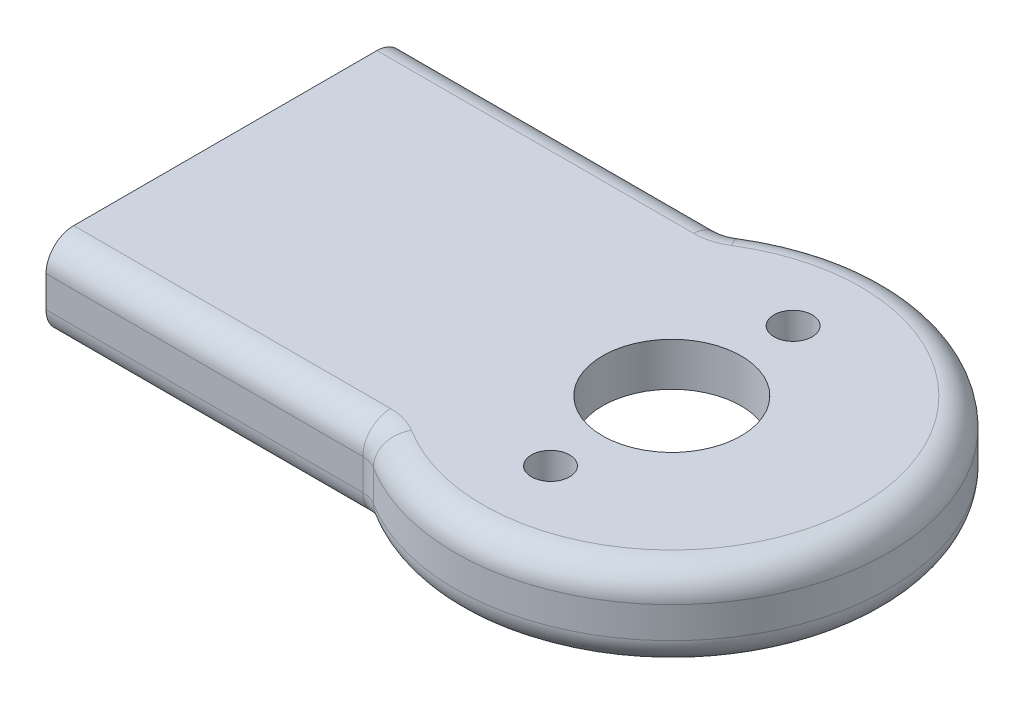
ISO-10303-21;
HEADER;
FILE_DESCRIPTION(('STEP AP214'),'2;1');
FILE_NAME('part.step','',(''),(''),'','','');
FILE_SCHEMA(('AUTOMOTIVE_DESIGN { 1 0 10303 214 1 1 1 1 }'));
ENDSEC;
DATA;
#1=APPLICATION_CONTEXT('core data for automotive mechanical design processes');
#2=APPLICATION_PROTOCOL_DEFINITION('international standard','automotive_design',2000,#1);
#3=PRODUCT_CONTEXT('',#1,'mechanical');
#4=PRODUCT('Part','Part','',(#3));
#5=PRODUCT_RELATED_PRODUCT_CATEGORY('part','',(#4));
#6=PRODUCT_DEFINITION_FORMATION('','',#4);
#7=PRODUCT_DEFINITION_CONTEXT('part definition',#1,'design');
#8=PRODUCT_DEFINITION('design','',#6,#7);
#9=PRODUCT_DEFINITION_SHAPE('','',#8);
#10=(LENGTH_UNIT() NAMED_UNIT(*) SI_UNIT(.MILLI.,.METRE.));
#11=(NAMED_UNIT(*) PLANE_ANGLE_UNIT() SI_UNIT($,.RADIAN.));
#12=(NAMED_UNIT(*) SI_UNIT($,.STERADIAN.) SOLID_ANGLE_UNIT());
#13=UNCERTAINTY_MEASURE_WITH_UNIT(LENGTH_MEASURE(1.E-05),#10,'distance_accuracy_value','');
#14=(GEOMETRIC_REPRESENTATION_CONTEXT(3) GLOBAL_UNCERTAINTY_ASSIGNED_CONTEXT((#13)) GLOBAL_UNIT_ASSIGNED_CONTEXT((#10,
#11,#12)) REPRESENTATION_CONTEXT('',''));
#15=CARTESIAN_POINT('',(0.,0.,0.));
#16=DIRECTION('',(0.,0.,1.));
#17=DIRECTION('',(1.,0.,0.));
#18=AXIS2_PLACEMENT_3D('',#15,#16,#17);
#19=CARTESIAN_POINT('',(0.,2.5,0.));
#20=DIRECTION('',(0.,1.,0.));
#21=DIRECTION('',(0.,0.,1.));
#22=AXIS2_PLACEMENT_3D('',#19,#20,#21);
#23=PLANE('',#22);
#24=DIRECTION('',(0.,0.,1.));
#25=VECTOR('',#24,1.);
#26=CARTESIAN_POINT('',(-25.7669633602051,2.5,-10.35));
#27=LINE('',#26,#25);
#28=CARTESIAN_POINT('',(-25.7669633602051,2.5,-8.75));
#29=VERTEX_POINT('',#28);
#30=CARTESIAN_POINT('',(-25.7669633602051,2.5,8.75));
#31=VERTEX_POINT('',#30);
#32=EDGE_CURVE('E201',#29,#31,#27,.T.);
#33=ORIENTED_EDGE('',*,*,#32,.T.);
#34=DIRECTION('',(1.,0.,0.));
#35=VECTOR('',#34,1.);
#36=CARTESIAN_POINT('',(-7.0091012262629,2.5,8.75));
#37=LINE('',#36,#35);
#38=CARTESIAN_POINT('',(-7.4838158715992,2.5,8.75));
#39=VERTEX_POINT('',#38);
#40=EDGE_CURVE('E222',#31,#39,#37,.T.);
#41=ORIENTED_EDGE('',*,*,#40,.T.);
#42=CARTESIAN_POINT('',(-7.4838158715992,2.5,11.95));
#43=DIRECTION('',(0.,1.,0.));
#44=DIRECTION('',(0.,0.,1.));
#45=AXIS2_PLACEMENT_3D('',#42,#43,#44);
#46=CIRCLE('',#45,3.2);
#47=CARTESIAN_POINT('',(-5.78536120570434,2.5,9.23794326241134));
#48=VERTEX_POINT('',#47);
#49=EDGE_CURVE('E219',#48,#39,#46,.T.);
#50=ORIENTED_EDGE('',*,*,#49,.F.);
#51=CARTESIAN_POINT('',(0.,2.5,0.));
#52=DIRECTION('',(0.,1.,0.));
#53=DIRECTION('',(0.,0.,1.));
#54=AXIS2_PLACEMENT_3D('',#51,#52,#53);
#55=CIRCLE('',#54,10.9);
#56=CARTESIAN_POINT('',(-5.78536120570434,2.5,-9.23794326241134));
#57=VERTEX_POINT('',#56);
#58=EDGE_CURVE('E215',#48,#57,#55,.T.);
#59=ORIENTED_EDGE('',*,*,#58,.T.);
#60=CARTESIAN_POINT('',(-7.4838158715992,2.5,-11.95));
#61=DIRECTION('',(0.,1.,0.));
#62=DIRECTION('',(0.,0.,1.));
#63=AXIS2_PLACEMENT_3D('',#60,#61,#62);
#64=CIRCLE('',#63,3.2);
#65=CARTESIAN_POINT('',(-7.4838158715992,2.5,-8.75));
#66=VERTEX_POINT('',#65);
#67=EDGE_CURVE('E212',#66,#57,#64,.T.);
#68=ORIENTED_EDGE('',*,*,#67,.F.);
#69=DIRECTION('',(-1.,0.,0.));
#70=VECTOR('',#69,1.);
#71=CARTESIAN_POINT('',(-25.7669633602051,2.5,-8.75));
#72=LINE('',#71,#70);
#73=EDGE_CURVE('E217',#66,#29,#72,.T.);
#74=ORIENTED_EDGE('',*,*,#73,.T.);
#75=EDGE_LOOP('',(#33,#41,#50,#59,#68,#74));
#76=FACE_BOUND('',#75,.T.);
#77=CARTESIAN_POINT('',(0.,2.5,-7.));
#78=DIRECTION('',(0.,1.,0.));
#79=DIRECTION('',(0.,0.,1.));
#80=AXIS2_PLACEMENT_3D('',#77,#78,#79);
#81=CIRCLE('',#80,1.1);
#82=CARTESIAN_POINT('',(0.,2.5,-5.9));
#83=VERTEX_POINT('',#82);
#84=EDGE_CURVE('E194',#83,#83,#81,.T.);
#85=ORIENTED_EDGE('',*,*,#84,.F.);
#86=EDGE_LOOP('',(#85));
#87=FACE_BOUND('',#86,.T.);
#88=CARTESIAN_POINT('',(0.,2.5,0.));
#89=DIRECTION('',(0.,1.,0.));
#90=DIRECTION('',(0.,0.,1.));
#91=AXIS2_PLACEMENT_3D('',#88,#89,#90);
#92=CIRCLE('',#91,4.);
#93=CARTESIAN_POINT('',(0.,2.5,4.));
#94=VERTEX_POINT('',#93);
#95=EDGE_CURVE('E197',#94,#94,#92,.T.);
#96=ORIENTED_EDGE('',*,*,#95,.F.);
#97=EDGE_LOOP('',(#96));
#98=FACE_BOUND('',#97,.T.);
#99=CARTESIAN_POINT('',(0.,2.5,7.));
#100=DIRECTION('',(0.,1.,0.));
#101=DIRECTION('',(0.,0.,-1.));
#102=AXIS2_PLACEMENT_3D('',#99,#100,#101);
#103=CIRCLE('',#102,1.1);
#104=CARTESIAN_POINT('',(0.,2.5,5.9));
#105=VERTEX_POINT('',#104);
#106=EDGE_CURVE('E188',#105,#105,#103,.T.);
#107=ORIENTED_EDGE('',*,*,#106,.F.);
#108=EDGE_LOOP('',(#107));
#109=FACE_BOUND('',#108,.T.);
#110=ADVANCED_FACE('F33',(#76,#87,#98,#109),#23,.T.);
#111=CARTESIAN_POINT('',(0.,-2.5,0.));
#112=DIRECTION('',(0.,1.,0.));
#113=DIRECTION('',(0.,0.,1.));
#114=AXIS2_PLACEMENT_3D('',#111,#112,#113);
#115=PLANE('',#114);
#116=CARTESIAN_POINT('',(0.,-2.5,0.));
#117=DIRECTION('',(0.,1.,0.));
#118=DIRECTION('',(0.,0.,1.));
#119=AXIS2_PLACEMENT_3D('',#116,#117,#118);
#120=CIRCLE('',#119,10.7);
#121=CARTESIAN_POINT('',(0.,-2.5,10.7));
#122=VERTEX_POINT('',#121);
#123=EDGE_CURVE('E176',#122,#122,#120,.F.);
#124=ORIENTED_EDGE('',*,*,#123,.F.);
#125=EDGE_LOOP('',(#124));
#126=FACE_BOUND('',#125,.T.);
#127=CARTESIAN_POINT('',(-7.4838158715992,-2.5,11.95));
#128=DIRECTION('',(0.,1.,0.));
#129=DIRECTION('',(0.,0.,1.));
#130=AXIS2_PLACEMENT_3D('',#127,#128,#129);
#131=CIRCLE('',#130,3.2);
#132=CARTESIAN_POINT('',(-7.4838158715992,-2.5,8.75));
#133=VERTEX_POINT('',#132);
#134=CARTESIAN_POINT('',(-5.78536120570434,-2.5,9.23794326241134));
#135=VERTEX_POINT('',#134);
#136=EDGE_CURVE('E239',#133,#135,#131,.F.);
#137=ORIENTED_EDGE('',*,*,#136,.F.);
#138=DIRECTION('',(1.,0.,0.));
#139=VECTOR('',#138,1.);
#140=CARTESIAN_POINT('',(0.,-2.5,8.75));
#141=LINE('',#140,#139);
#142=CARTESIAN_POINT('',(-25.7669633602051,-2.5,8.75));
#143=VERTEX_POINT('',#142);
#144=EDGE_CURVE('E249',#133,#143,#141,.F.);
#145=ORIENTED_EDGE('',*,*,#144,.T.);
#146=DIRECTION('',(0.,0.,1.));
#147=VECTOR('',#146,1.);
#148=CARTESIAN_POINT('',(-25.7669633602051,-2.5,-10.35));
#149=LINE('',#148,#147);
#150=CARTESIAN_POINT('',(-25.7669633602051,-2.5,-8.75));
#151=VERTEX_POINT('',#150);
#152=EDGE_CURVE('E200',#151,#143,#149,.T.);
#153=ORIENTED_EDGE('',*,*,#152,.F.);
#154=DIRECTION('',(-1.,0.,0.));
#155=VECTOR('',#154,1.);
#156=CARTESIAN_POINT('',(0.,-2.5,-8.75));
#157=LINE('',#156,#155);
#158=CARTESIAN_POINT('',(-7.4838158715992,-2.5,-8.75));
#159=VERTEX_POINT('',#158);
#160=EDGE_CURVE('E247',#151,#159,#157,.F.);
#161=ORIENTED_EDGE('',*,*,#160,.T.);
#162=CARTESIAN_POINT('',(-7.4838158715992,-2.5,-11.95));
#163=DIRECTION('',(0.,1.,0.));
#164=DIRECTION('',(0.,0.,1.));
#165=AXIS2_PLACEMENT_3D('',#162,#163,#164);
#166=CIRCLE('',#165,3.2);
#167=CARTESIAN_POINT('',(-5.78536120570434,-2.5,-9.23794326241134));
#168=VERTEX_POINT('',#167);
#169=EDGE_CURVE('E244',#168,#159,#166,.F.);
#170=ORIENTED_EDGE('',*,*,#169,.F.);
#171=CARTESIAN_POINT('',(0.,-2.5,0.));
#172=DIRECTION('',(0.,1.,0.));
#173=DIRECTION('',(0.,0.,1.));
#174=AXIS2_PLACEMENT_3D('',#171,#172,#173);
#175=CIRCLE('',#174,10.9);
#176=EDGE_CURVE('E242',#168,#135,#175,.F.);
#177=ORIENTED_EDGE('',*,*,#176,.T.);
#178=EDGE_LOOP('',(#137,#145,#153,#161,#170,#177));
#179=FACE_BOUND('',#178,.T.);
#180=ADVANCED_FACE('F318',(#126,#179),#115,.F.);
#181=CARTESIAN_POINT('',(-25.7669633602051,2.5,-10.35));
#182=DIRECTION('',(1.,0.,0.));
#183=DIRECTION('',(0.,0.,-1.));
#184=AXIS2_PLACEMENT_3D('',#181,#182,#183);
#185=PLANE('',#184);
#186=DIRECTION('',(0.,0.,1.));
#187=VECTOR('',#186,1.);
#188=CARTESIAN_POINT('',(-25.7669633602051,-1.,-6.55));
#189=LINE('',#188,#187);
#190=CARTESIAN_POINT('',(-25.7669633602051,-1.,-6.55));
#191=VERTEX_POINT('',#190);
#192=CARTESIAN_POINT('',(-25.7669633602051,-1.,6.55));
#193=VERTEX_POINT('',#192);
#194=EDGE_CURVE('E182',#191,#193,#189,.T.);
#195=ORIENTED_EDGE('',*,*,#194,.F.);
#196=DIRECTION('',(0.,-1.,0.));
#197=VECTOR('',#196,1.);
#198=CARTESIAN_POINT('',(-25.7669633602051,1.,-6.55));
#199=LINE('',#198,#197);
#200=CARTESIAN_POINT('',(-25.7669633602051,1.,-6.55));
#201=VERTEX_POINT('',#200);
#202=EDGE_CURVE('E153',#201,#191,#199,.T.);
#203=ORIENTED_EDGE('',*,*,#202,.F.);
#204=DIRECTION('',(0.,0.,-1.));
#205=VECTOR('',#204,1.);
#206=CARTESIAN_POINT('',(-25.7669633602051,1.,-6.55));
#207=LINE('',#206,#205);
#208=CARTESIAN_POINT('',(-25.7669633602051,1.,6.55));
#209=VERTEX_POINT('',#208);
#210=EDGE_CURVE('E170',#209,#201,#207,.T.);
#211=ORIENTED_EDGE('',*,*,#210,.F.);
#212=DIRECTION('',(0.,1.,0.));
#213=VECTOR('',#212,1.);
#214=CARTESIAN_POINT('',(-25.7669633602051,1.,6.55));
#215=LINE('',#214,#213);
#216=EDGE_CURVE('E173',#193,#209,#215,.T.);
#217=ORIENTED_EDGE('',*,*,#216,.F.);
#218=EDGE_LOOP('',(#195,#203,#211,#217));
#219=FACE_BOUND('',#218,.T.);
#220=DIRECTION('',(0.,-1.,0.));
#221=VECTOR('',#220,1.);
#222=CARTESIAN_POINT('',(-25.7669633602051,2.5,10.35));
#223=LINE('',#222,#221);
#224=CARTESIAN_POINT('',(-25.7669633602051,0.9,10.35));
#225=VERTEX_POINT('',#224);
#226=CARTESIAN_POINT('',(-25.7669633602051,-0.9,10.35));
#227=VERTEX_POINT('',#226);
#228=EDGE_CURVE('E209',#225,#227,#223,.T.);
#229=ORIENTED_EDGE('',*,*,#228,.F.);
#230=CARTESIAN_POINT('',(-25.7669633602051,0.9,8.75));
#231=DIRECTION('',(1.,0.,0.));
#232=DIRECTION('',(0.,0.,-1.));
#233=AXIS2_PLACEMENT_3D('',#230,#231,#232);
#234=CIRCLE('',#233,1.6);
#235=EDGE_CURVE('E237',#225,#31,#234,.F.);
#236=ORIENTED_EDGE('',*,*,#235,.T.);
#237=ORIENTED_EDGE('',*,*,#32,.F.);
#238=CARTESIAN_POINT('',(-25.7669633602051,0.9,-8.75));
#239=DIRECTION('',(1.,0.,0.));
#240=DIRECTION('',(0.,0.,-1.));
#241=AXIS2_PLACEMENT_3D('',#238,#239,#240);
#242=CIRCLE('',#241,1.6);
#243=CARTESIAN_POINT('',(-25.7669633602051,0.9,-10.35));
#244=VERTEX_POINT('',#243);
#245=EDGE_CURVE('E233',#29,#244,#242,.F.);
#246=ORIENTED_EDGE('',*,*,#245,.T.);
#247=DIRECTION('',(0.,-1.,0.));
#248=VECTOR('',#247,1.);
#249=CARTESIAN_POINT('',(-25.7669633602051,2.5,-10.35));
#250=LINE('',#249,#248);
#251=CARTESIAN_POINT('',(-25.7669633602051,-0.9,-10.35));
#252=VERTEX_POINT('',#251);
#253=EDGE_CURVE('E204',#244,#252,#250,.T.);
#254=ORIENTED_EDGE('',*,*,#253,.T.);
#255=CARTESIAN_POINT('',(-25.7669633602051,-0.9,-8.75));
#256=DIRECTION('',(1.,0.,0.));
#257=DIRECTION('',(0.,0.,-1.));
#258=AXIS2_PLACEMENT_3D('',#255,#256,#257);
#259=CIRCLE('',#258,1.6);
#260=EDGE_CURVE('E231',#252,#151,#259,.F.);
#261=ORIENTED_EDGE('',*,*,#260,.T.);
#262=ORIENTED_EDGE('',*,*,#152,.T.);
#263=CARTESIAN_POINT('',(-25.7669633602051,-0.9,8.75));
#264=DIRECTION('',(1.,0.,0.));
#265=DIRECTION('',(0.,0.,-1.));
#266=AXIS2_PLACEMENT_3D('',#263,#264,#265);
#267=CIRCLE('',#266,1.6);
#268=EDGE_CURVE('E235',#143,#227,#267,.F.);
#269=ORIENTED_EDGE('',*,*,#268,.T.);
#270=EDGE_LOOP('',(#229,#236,#237,#246,#254,#261,#262,#269));
#271=FACE_BOUND('',#270,.T.);
#272=ADVANCED_FACE('F321',(#219,#271),#185,.F.);
#273=CARTESIAN_POINT('',(-25.7669633602051,2.5,10.35));
#274=DIRECTION('',(0.,0.,-1.));
#275=DIRECTION('',(-1.,0.,0.));
#276=AXIS2_PLACEMENT_3D('',#273,#274,#275);
#277=PLANE('',#276);
#278=DIRECTION('',(0.,1.,0.));
#279=VECTOR('',#278,1.);
#280=CARTESIAN_POINT('',(-7.4838158715992,2.5,10.35));
#281=LINE('',#280,#279);
#282=CARTESIAN_POINT('',(-7.4838158715992,-0.9,10.35));
#283=VERTEX_POINT('',#282);
#284=CARTESIAN_POINT('',(-7.4838158715992,0.9,10.35));
#285=VERTEX_POINT('',#284);
#286=EDGE_CURVE('E225',#283,#285,#281,.T.);
#287=ORIENTED_EDGE('',*,*,#286,.T.);
#288=DIRECTION('',(1.,0.,0.));
#289=VECTOR('',#288,1.);
#290=CARTESIAN_POINT('',(-25.7669633602051,0.9,10.35));
#291=LINE('',#290,#289);
#292=EDGE_CURVE('E229',#285,#225,#291,.F.);
#293=ORIENTED_EDGE('',*,*,#292,.T.);
#294=ORIENTED_EDGE('',*,*,#228,.T.);
#295=DIRECTION('',(1.,0.,0.));
#296=VECTOR('',#295,1.);
#297=CARTESIAN_POINT('',(-25.7669633602051,-0.9,10.35));
#298=LINE('',#297,#296);
#299=EDGE_CURVE('E227',#227,#283,#298,.T.);
#300=ORIENTED_EDGE('',*,*,#299,.T.);
#301=EDGE_LOOP('',(#287,#293,#294,#300));
#302=FACE_BOUND('',#301,.T.);
#303=ADVANCED_FACE('F342',(#302),#277,.F.);
#304=CARTESIAN_POINT('',(0.,2.5,0.));
#305=DIRECTION('',(0.,-1.,0.));
#306=DIRECTION('',(0.,0.,-1.));
#307=AXIS2_PLACEMENT_3D('',#304,#305,#306);
#308=CYLINDRICAL_SURFACE('',#307,12.5);
#309=CARTESIAN_POINT('',(0.,0.9,0.));
#310=DIRECTION('',(0.,1.,0.));
#311=DIRECTION('',(0.,0.,1.));
#312=AXIS2_PLACEMENT_3D('',#309,#310,#311);
#313=CIRCLE('',#312,12.5);
#314=CARTESIAN_POINT('',(-6.63458853865177,0.9,-10.5939716312057));
#315=VERTEX_POINT('',#314);
#316=CARTESIAN_POINT('',(-6.63458853865177,0.9,10.5939716312057));
#317=VERTEX_POINT('',#316);
#318=EDGE_CURVE('E42',#315,#317,#313,.F.);
#319=ORIENTED_EDGE('',*,*,#318,.T.);
#320=DIRECTION('',(0.,-1.,0.));
#321=VECTOR('',#320,1.);
#322=CARTESIAN_POINT('',(-6.63458853865177,2.5,10.5939716312057));
#323=LINE('',#322,#321);
#324=CARTESIAN_POINT('',(-6.63458853865177,-0.9,10.5939716312057));
#325=VERTEX_POINT('',#324);
#326=EDGE_CURVE('E11',#317,#325,#323,.T.);
#327=ORIENTED_EDGE('',*,*,#326,.T.);
#328=CARTESIAN_POINT('',(0.,-0.9,0.));
#329=DIRECTION('',(0.,1.,0.));
#330=DIRECTION('',(0.,0.,1.));
#331=AXIS2_PLACEMENT_3D('',#328,#329,#330);
#332=CIRCLE('',#331,12.5);
#333=CARTESIAN_POINT('',(-6.63458853865177,-0.9,-10.5939716312057));
#334=VERTEX_POINT('',#333);
#335=EDGE_CURVE('E257',#325,#334,#332,.T.);
#336=ORIENTED_EDGE('',*,*,#335,.T.);
#337=DIRECTION('',(0.,-1.,0.));
#338=VECTOR('',#337,1.);
#339=CARTESIAN_POINT('',(-6.63458853865177,2.5,-10.5939716312057));
#340=LINE('',#339,#338);
#341=EDGE_CURVE('E53',#334,#315,#340,.F.);
#342=ORIENTED_EDGE('',*,*,#341,.T.);
#343=EDGE_LOOP('',(#319,#327,#336,#342));
#344=FACE_BOUND('',#343,.T.);
#345=ADVANCED_FACE('F391',(#344),#308,.T.);
#346=CARTESIAN_POINT('',(-25.7669633602051,2.5,-10.35));
#347=DIRECTION('',(0.,0.,1.));
#348=DIRECTION('',(1.,0.,0.));
#349=AXIS2_PLACEMENT_3D('',#346,#347,#348);
#350=PLANE('',#349);
#351=ORIENTED_EDGE('',*,*,#253,.F.);
#352=DIRECTION('',(-1.,0.,0.));
#353=VECTOR('',#352,1.);
#354=CARTESIAN_POINT('',(-7.0091012262629,0.9,-10.35));
#355=LINE('',#354,#353);
#356=CARTESIAN_POINT('',(-7.4838158715992,0.9,-10.35));
#357=VERTEX_POINT('',#356);
#358=EDGE_CURVE('E255',#244,#357,#355,.F.);
#359=ORIENTED_EDGE('',*,*,#358,.T.);
#360=DIRECTION('',(0.,1.,0.));
#361=VECTOR('',#360,1.);
#362=CARTESIAN_POINT('',(-7.4838158715992,-2.5,-10.35));
#363=LINE('',#362,#361);
#364=CARTESIAN_POINT('',(-7.4838158715992,-0.9,-10.35));
#365=VERTEX_POINT('',#364);
#366=EDGE_CURVE('E251',#357,#365,#363,.F.);
#367=ORIENTED_EDGE('',*,*,#366,.T.);
#368=DIRECTION('',(-1.,0.,0.));
#369=VECTOR('',#368,1.);
#370=CARTESIAN_POINT('',(-25.7669633602051,-0.9,-10.35));
#371=LINE('',#370,#369);
#372=EDGE_CURVE('E253',#365,#252,#371,.T.);
#373=ORIENTED_EDGE('',*,*,#372,.T.);
#374=EDGE_LOOP('',(#351,#359,#367,#373));
#375=FACE_BOUND('',#374,.T.);
#376=ADVANCED_FACE('F362',(#375),#350,.F.);
#377=CARTESIAN_POINT('',(0.,2.5,0.));
#378=DIRECTION('',(0.,-1.,0.));
#379=DIRECTION('',(0.,0.,-1.));
#380=AXIS2_PLACEMENT_3D('',#377,#378,#379);
#381=CYLINDRICAL_SURFACE('',#380,4.);
#382=CARTESIAN_POINT('',(0.,0.,0.));
#383=DIRECTION('',(0.,1.,0.));
#384=DIRECTION('',(0.,0.,1.));
#385=AXIS2_PLACEMENT_3D('',#382,#383,#384);
#386=CIRCLE('',#385,4.);
#387=CARTESIAN_POINT('',(0.,0.,4.));
#388=VERTEX_POINT('',#387);
#389=EDGE_CURVE('E303',#388,#388,#386,.F.);
#390=ORIENTED_EDGE('',*,*,#389,.T.);
#391=EDGE_LOOP('',(#390));
#392=FACE_BOUND('',#391,.T.);
#393=ORIENTED_EDGE('',*,*,#95,.T.);
#394=EDGE_LOOP('',(#393));
#395=FACE_BOUND('',#394,.T.);
#396=ADVANCED_FACE('F386',(#392,#395),#381,.F.);
#397=CARTESIAN_POINT('',(0.,2.5,-7.));
#398=DIRECTION('',(0.,-1.,0.));
#399=DIRECTION('',(0.,0.,-1.));
#400=AXIS2_PLACEMENT_3D('',#397,#398,#399);
#401=CYLINDRICAL_SURFACE('',#400,1.1);
#402=CARTESIAN_POINT('',(0.,0.,-7.));
#403=DIRECTION('',(0.,1.,0.));
#404=DIRECTION('',(0.,0.,1.));
#405=AXIS2_PLACEMENT_3D('',#402,#403,#404);
#406=CIRCLE('',#405,1.1);
#407=CARTESIAN_POINT('',(0.,0.,-5.9));
#408=VERTEX_POINT('',#407);
#409=EDGE_CURVE('E298',#408,#408,#406,.F.);
#410=ORIENTED_EDGE('',*,*,#409,.T.);
#411=EDGE_LOOP('',(#410));
#412=FACE_BOUND('',#411,.T.);
#413=ORIENTED_EDGE('',*,*,#84,.T.);
#414=EDGE_LOOP('',(#413));
#415=FACE_BOUND('',#414,.T.);
#416=ADVANCED_FACE('F421',(#412,#415),#401,.F.);
#417=CARTESIAN_POINT('',(0.,2.5,7.));
#418=DIRECTION('',(0.,-1.,0.));
#419=DIRECTION('',(0.,0.,-1.));
#420=AXIS2_PLACEMENT_3D('',#417,#418,#419);
#421=CYLINDRICAL_SURFACE('',#420,1.1);
#422=CARTESIAN_POINT('',(0.,0.,7.));
#423=DIRECTION('',(0.,1.,0.));
#424=DIRECTION('',(0.,0.,1.));
#425=AXIS2_PLACEMENT_3D('',#422,#423,#424);
#426=CIRCLE('',#425,1.1);
#427=CARTESIAN_POINT('',(0.,0.,8.1));
#428=VERTEX_POINT('',#427);
#429=EDGE_CURVE('E294',#428,#428,#426,.F.);
#430=ORIENTED_EDGE('',*,*,#429,.T.);
#431=EDGE_LOOP('',(#430));
#432=FACE_BOUND('',#431,.T.);
#433=ORIENTED_EDGE('',*,*,#106,.T.);
#434=EDGE_LOOP('',(#433));
#435=FACE_BOUND('',#434,.T.);
#436=ADVANCED_FACE('F413',(#432,#435),#421,.F.);
#437=CARTESIAN_POINT('',(-10.7669633602051,1.,-6.55));
#438=DIRECTION('',(0.,0.,-1.));
#439=DIRECTION('',(-1.,0.,0.));
#440=AXIS2_PLACEMENT_3D('',#437,#438,#439);
#441=PLANE('',#440);
#442=ORIENTED_EDGE('',*,*,#202,.T.);
#443=DIRECTION('',(-1.,0.,0.));
#444=VECTOR('',#443,1.);
#445=CARTESIAN_POINT('',(-10.7669633602051,-1.,-6.55));
#446=LINE('',#445,#444);
#447=CARTESIAN_POINT('',(-10.7669633602051,-1.,-6.55));
#448=VERTEX_POINT('',#447);
#449=EDGE_CURVE('E146',#448,#191,#446,.T.);
#450=ORIENTED_EDGE('',*,*,#449,.F.);
#451=DIRECTION('',(0.,-1.,0.));
#452=VECTOR('',#451,1.);
#453=CARTESIAN_POINT('',(-10.7669633602051,1.,-6.55));
#454=LINE('',#453,#452);
#455=CARTESIAN_POINT('',(-10.7669633602051,1.,-6.55));
#456=VERTEX_POINT('',#455);
#457=EDGE_CURVE('E150',#456,#448,#454,.T.);
#458=ORIENTED_EDGE('',*,*,#457,.F.);
#459=DIRECTION('',(-1.,0.,0.));
#460=VECTOR('',#459,1.);
#461=CARTESIAN_POINT('',(-10.7669633602051,1.,-6.55));
#462=LINE('',#461,#460);
#463=EDGE_CURVE('E186',#456,#201,#462,.T.);
#464=ORIENTED_EDGE('',*,*,#463,.T.);
#465=EDGE_LOOP('',(#442,#450,#458,#464));
#466=FACE_BOUND('',#465,.T.);
#467=ADVANCED_FACE('F148',(#466),#441,.F.);
#468=CARTESIAN_POINT('',(-10.7669633602051,1.,-6.55));
#469=DIRECTION('',(0.,1.,0.));
#470=DIRECTION('',(0.,0.,1.));
#471=AXIS2_PLACEMENT_3D('',#468,#469,#470);
#472=PLANE('',#471);
#473=ORIENTED_EDGE('',*,*,#210,.T.);
#474=ORIENTED_EDGE('',*,*,#463,.F.);
#475=DIRECTION('',(0.,0.,-1.));
#476=VECTOR('',#475,1.);
#477=CARTESIAN_POINT('',(-10.7669633602051,1.,-6.55));
#478=LINE('',#477,#476);
#479=CARTESIAN_POINT('',(-10.7669633602051,1.,6.55));
#480=VERTEX_POINT('',#479);
#481=EDGE_CURVE('E158',#480,#456,#478,.T.);
#482=ORIENTED_EDGE('',*,*,#481,.F.);
#483=DIRECTION('',(-1.,0.,0.));
#484=VECTOR('',#483,1.);
#485=CARTESIAN_POINT('',(-10.7669633602051,1.,6.55));
#486=LINE('',#485,#484);
#487=EDGE_CURVE('E189',#480,#209,#486,.T.);
#488=ORIENTED_EDGE('',*,*,#487,.T.);
#489=EDGE_LOOP('',(#473,#474,#482,#488));
#490=FACE_BOUND('',#489,.T.);
#491=ADVANCED_FACE('F405',(#490),#472,.F.);
#492=CARTESIAN_POINT('',(-10.7669633602051,1.,6.55));
#493=DIRECTION('',(0.,0.,1.));
#494=DIRECTION('',(0.,-1.,0.));
#495=AXIS2_PLACEMENT_3D('',#492,#493,#494);
#496=PLANE('',#495);
#497=ORIENTED_EDGE('',*,*,#216,.T.);
#498=ORIENTED_EDGE('',*,*,#487,.F.);
#499=DIRECTION('',(0.,1.,0.));
#500=VECTOR('',#499,1.);
#501=CARTESIAN_POINT('',(-10.7669633602051,1.,6.55));
#502=LINE('',#501,#500);
#503=CARTESIAN_POINT('',(-10.7669633602051,-1.,6.55));
#504=VERTEX_POINT('',#503);
#505=EDGE_CURVE('E166',#504,#480,#502,.T.);
#506=ORIENTED_EDGE('',*,*,#505,.F.);
#507=DIRECTION('',(-1.,0.,0.));
#508=VECTOR('',#507,1.);
#509=CARTESIAN_POINT('',(-10.7669633602051,-1.,6.55));
#510=LINE('',#509,#508);
#511=EDGE_CURVE('E157',#504,#193,#510,.T.);
#512=ORIENTED_EDGE('',*,*,#511,.T.);
#513=EDGE_LOOP('',(#497,#498,#506,#512));
#514=FACE_BOUND('',#513,.T.);
#515=ADVANCED_FACE('F403',(#514),#496,.F.);
#516=CARTESIAN_POINT('',(-10.7669633602051,-1.,-6.55));
#517=DIRECTION('',(0.,-1.,0.));
#518=DIRECTION('',(0.,0.,-1.));
#519=AXIS2_PLACEMENT_3D('',#516,#517,#518);
#520=PLANE('',#519);
#521=ORIENTED_EDGE('',*,*,#194,.T.);
#522=ORIENTED_EDGE('',*,*,#511,.F.);
#523=DIRECTION('',(0.,0.,1.));
#524=VECTOR('',#523,1.);
#525=CARTESIAN_POINT('',(-10.7669633602051,-1.,-6.55));
#526=LINE('',#525,#524);
#527=EDGE_CURVE('E161',#448,#504,#526,.T.);
#528=ORIENTED_EDGE('',*,*,#527,.F.);
#529=ORIENTED_EDGE('',*,*,#449,.T.);
#530=EDGE_LOOP('',(#521,#522,#528,#529));
#531=FACE_BOUND('',#530,.T.);
#532=ADVANCED_FACE('F162',(#531),#520,.F.);
#533=CARTESIAN_POINT('',(-10.7669633602051,0.,0.));
#534=DIRECTION('',(-1.,0.,0.));
#535=DIRECTION('',(0.,0.,1.));
#536=AXIS2_PLACEMENT_3D('',#533,#534,#535);
#537=PLANE('',#536);
#538=ORIENTED_EDGE('',*,*,#457,.T.);
#539=ORIENTED_EDGE('',*,*,#527,.T.);
#540=ORIENTED_EDGE('',*,*,#505,.T.);
#541=ORIENTED_EDGE('',*,*,#481,.T.);
#542=EDGE_LOOP('',(#538,#539,#540,#541));
#543=FACE_BOUND('',#542,.T.);
#544=ADVANCED_FACE('F168',(#543),#537,.T.);
#545=CARTESIAN_POINT('',(0.,-2.501,0.));
#546=DIRECTION('',(0.,1.,0.));
#547=DIRECTION('',(0.,0.,1.));
#548=AXIS2_PLACEMENT_3D('',#545,#546,#547);
#549=CYLINDRICAL_SURFACE('',#548,10.7);
#550=CARTESIAN_POINT('',(0.,0.,0.));
#551=DIRECTION('',(0.,1.,0.));
#552=DIRECTION('',(0.,0.,1.));
#553=AXIS2_PLACEMENT_3D('',#550,#551,#552);
#554=CIRCLE('',#553,10.7);
#555=CARTESIAN_POINT('',(0.,0.,10.7));
#556=VERTEX_POINT('',#555);
#557=EDGE_CURVE('E306',#556,#556,#554,.T.);
#558=ORIENTED_EDGE('',*,*,#557,.T.);
#559=EDGE_LOOP('',(#558));
#560=FACE_BOUND('',#559,.T.);
#561=ORIENTED_EDGE('',*,*,#123,.T.);
#562=EDGE_LOOP('',(#561));
#563=FACE_BOUND('',#562,.T.);
#564=ADVANCED_FACE('F316',(#560,#563),#549,.F.);
#565=CARTESIAN_POINT('',(0.,0.,0.));
#566=DIRECTION('',(0.,1.,0.));
#567=DIRECTION('',(0.,0.,1.));
#568=AXIS2_PLACEMENT_3D('',#565,#566,#567);
#569=PLANE('',#568);
#570=ORIENTED_EDGE('',*,*,#389,.F.);
#571=EDGE_LOOP('',(#570));
#572=FACE_BOUND('',#571,.T.);
#573=ORIENTED_EDGE('',*,*,#409,.F.);
#574=EDGE_LOOP('',(#573));
#575=FACE_BOUND('',#574,.T.);
#576=ORIENTED_EDGE('',*,*,#429,.F.);
#577=EDGE_LOOP('',(#576));
#578=FACE_BOUND('',#577,.T.);
#579=ORIENTED_EDGE('',*,*,#557,.F.);
#580=EDGE_LOOP('',(#579));
#581=FACE_BOUND('',#580,.T.);
#582=ADVANCED_FACE('F437',(#572,#575,#578,#581),#569,.F.);
#583=CARTESIAN_POINT('',(-25.7669633602051,-0.9,-8.75));
#584=DIRECTION('',(-1.,0.,0.));
#585=DIRECTION('',(0.,0.,1.));
#586=AXIS2_PLACEMENT_3D('',#583,#584,#585);
#587=CYLINDRICAL_SURFACE('',#586,1.6);
#588=CARTESIAN_POINT('',(-7.4838158715992,-0.9,-8.75));
#589=DIRECTION('',(1.,0.,0.));
#590=DIRECTION('',(0.,0.,-1.));
#591=AXIS2_PLACEMENT_3D('',#588,#589,#590);
#592=CIRCLE('',#591,1.6);
#593=EDGE_CURVE('E37',#159,#365,#592,.T.);
#594=ORIENTED_EDGE('',*,*,#593,.F.);
#595=ORIENTED_EDGE('',*,*,#160,.F.);
#596=ORIENTED_EDGE('',*,*,#260,.F.);
#597=ORIENTED_EDGE('',*,*,#372,.F.);
#598=EDGE_LOOP('',(#594,#595,#596,#597));
#599=FACE_BOUND('',#598,.T.);
#600=ADVANCED_FACE('F35',(#599),#587,.T.);
#601=CARTESIAN_POINT('',(-7.4838158715992,-0.9,-11.95));
#602=DIRECTION('',(0.,1.,0.));
#603=DIRECTION('',(0.,0.,1.));
#604=AXIS2_PLACEMENT_3D('',#601,#602,#603);
#605=TOROIDAL_SURFACE('',#604,3.2,1.6);
#606=ORIENTED_EDGE('',*,*,#169,.T.);
#607=ORIENTED_EDGE('',*,*,#593,.T.);
#608=CARTESIAN_POINT('',(-7.4838158715992,-0.9,-11.95));
#609=DIRECTION('',(0.,1.,0.));
#610=DIRECTION('',(0.,0.,1.));
#611=AXIS2_PLACEMENT_3D('',#608,#609,#610);
#612=CIRCLE('',#611,1.6);
#613=EDGE_CURVE('E288',#334,#365,#612,.F.);
#614=ORIENTED_EDGE('',*,*,#613,.F.);
#615=CARTESIAN_POINT('',(-5.78536120570434,-0.9,-9.23794326241134));
#616=DIRECTION('',(-0.847517730496454,0.,0.530767083092141));
#617=DIRECTION('',(0.530767083092141,0.,0.847517730496454));
#618=AXIS2_PLACEMENT_3D('',#615,#616,#617);
#619=CIRCLE('',#618,1.6);
#620=EDGE_CURVE('E286',#168,#334,#619,.F.);
#621=ORIENTED_EDGE('',*,*,#620,.F.);
#622=EDGE_LOOP('',(#606,#607,#614,#621));
#623=FACE_BOUND('',#622,.T.);
#624=ADVANCED_FACE('F447',(#623),#605,.T.);
#625=CARTESIAN_POINT('',(0.,0.9,-8.75));
#626=DIRECTION('',(1.,0.,0.));
#627=DIRECTION('',(0.,0.,-1.));
#628=AXIS2_PLACEMENT_3D('',#625,#626,#627);
#629=CYLINDRICAL_SURFACE('',#628,1.6);
#630=ORIENTED_EDGE('',*,*,#245,.F.);
#631=ORIENTED_EDGE('',*,*,#73,.F.);
#632=CARTESIAN_POINT('',(-7.4838158715992,0.9,-8.75));
#633=DIRECTION('',(1.,0.,0.));
#634=DIRECTION('',(0.,0.,-1.));
#635=AXIS2_PLACEMENT_3D('',#632,#633,#634);
#636=CIRCLE('',#635,1.6);
#637=EDGE_CURVE('E283',#357,#66,#636,.T.);
#638=ORIENTED_EDGE('',*,*,#637,.F.);
#639=ORIENTED_EDGE('',*,*,#358,.F.);
#640=EDGE_LOOP('',(#630,#631,#638,#639));
#641=FACE_BOUND('',#640,.T.);
#642=ADVANCED_FACE('F359',(#641),#629,.T.);
#643=CARTESIAN_POINT('',(-7.4838158715992,2.5,-11.95));
#644=DIRECTION('',(0.,-1.,0.));
#645=DIRECTION('',(0.,0.,-1.));
#646=AXIS2_PLACEMENT_3D('',#643,#644,#645);
#647=CYLINDRICAL_SURFACE('',#646,1.6);
#648=ORIENTED_EDGE('',*,*,#613,.T.);
#649=ORIENTED_EDGE('',*,*,#366,.F.);
#650=CARTESIAN_POINT('',(-7.4838158715992,0.9,-11.95));
#651=DIRECTION('',(0.,1.,0.));
#652=DIRECTION('',(0.,0.,1.));
#653=AXIS2_PLACEMENT_3D('',#650,#651,#652);
#654=CIRCLE('',#653,1.6);
#655=EDGE_CURVE('E280',#315,#357,#654,.F.);
#656=ORIENTED_EDGE('',*,*,#655,.F.);
#657=ORIENTED_EDGE('',*,*,#341,.F.);
#658=EDGE_LOOP('',(#648,#649,#656,#657));
#659=FACE_BOUND('',#658,.T.);
#660=ADVANCED_FACE('F364',(#659),#647,.F.);
#661=CARTESIAN_POINT('',(0.,-0.9,0.));
#662=DIRECTION('',(0.,1.,0.));
#663=DIRECTION('',(0.,0.,1.));
#664=AXIS2_PLACEMENT_3D('',#661,#662,#663);
#665=TOROIDAL_SURFACE('',#664,10.9,1.6);
#666=ORIENTED_EDGE('',*,*,#620,.T.);
#667=ORIENTED_EDGE('',*,*,#335,.F.);
#668=CARTESIAN_POINT('',(-5.78536120570434,-0.9,9.23794326241134));
#669=DIRECTION('',(-0.847517730496454,0.,-0.530767083092141));
#670=DIRECTION('',(-0.530767083092141,0.,0.847517730496454));
#671=AXIS2_PLACEMENT_3D('',#668,#669,#670);
#672=CIRCLE('',#671,1.6);
#673=EDGE_CURVE('E277',#135,#325,#672,.T.);
#674=ORIENTED_EDGE('',*,*,#673,.F.);
#675=ORIENTED_EDGE('',*,*,#176,.F.);
#676=EDGE_LOOP('',(#666,#667,#674,#675));
#677=FACE_BOUND('',#676,.T.);
#678=ADVANCED_FACE('F552',(#677),#665,.T.);
#679=CARTESIAN_POINT('',(-25.7669633602051,-0.9,8.75));
#680=DIRECTION('',(1.,0.,0.));
#681=DIRECTION('',(0.,0.,-1.));
#682=AXIS2_PLACEMENT_3D('',#679,#680,#681);
#683=CYLINDRICAL_SURFACE('',#682,1.6);
#684=ORIENTED_EDGE('',*,*,#268,.F.);
#685=ORIENTED_EDGE('',*,*,#144,.F.);
#686=CARTESIAN_POINT('',(-7.4838158715992,-0.9,8.75));
#687=DIRECTION('',(1.,0.,0.));
#688=DIRECTION('',(0.,0.,-1.));
#689=AXIS2_PLACEMENT_3D('',#686,#687,#688);
#690=CIRCLE('',#689,1.6);
#691=EDGE_CURVE('E274',#283,#133,#690,.T.);
#692=ORIENTED_EDGE('',*,*,#691,.F.);
#693=ORIENTED_EDGE('',*,*,#299,.F.);
#694=EDGE_LOOP('',(#684,#685,#692,#693));
#695=FACE_BOUND('',#694,.T.);
#696=ADVANCED_FACE('F331',(#695),#683,.T.);
#697=CARTESIAN_POINT('',(-7.4838158715992,0.9,-11.95));
#698=DIRECTION('',(0.,1.,0.));
#699=DIRECTION('',(0.,0.,1.));
#700=AXIS2_PLACEMENT_3D('',#697,#698,#699);
#701=TOROIDAL_SURFACE('',#700,3.2,1.6);
#702=ORIENTED_EDGE('',*,*,#637,.T.);
#703=ORIENTED_EDGE('',*,*,#67,.T.);
#704=CARTESIAN_POINT('',(-5.78536120570434,0.9,-9.23794326241134));
#705=DIRECTION('',(-0.847517730496454,0.,0.530767083092141));
#706=DIRECTION('',(0.530767083092141,0.,0.847517730496454));
#707=AXIS2_PLACEMENT_3D('',#704,#705,#706);
#708=CIRCLE('',#707,1.6);
#709=EDGE_CURVE('E271',#315,#57,#708,.F.);
#710=ORIENTED_EDGE('',*,*,#709,.F.);
#711=ORIENTED_EDGE('',*,*,#655,.T.);
#712=EDGE_LOOP('',(#702,#703,#710,#711));
#713=FACE_BOUND('',#712,.T.);
#714=ADVANCED_FACE('F367',(#713),#701,.T.);
#715=CARTESIAN_POINT('',(-7.4838158715992,-0.9,11.95));
#716=DIRECTION('',(0.,1.,0.));
#717=DIRECTION('',(0.,0.,1.));
#718=AXIS2_PLACEMENT_3D('',#715,#716,#717);
#719=TOROIDAL_SURFACE('',#718,3.2,1.6);
#720=ORIENTED_EDGE('',*,*,#136,.T.);
#721=ORIENTED_EDGE('',*,*,#673,.T.);
#722=CARTESIAN_POINT('',(-7.4838158715992,-0.9,11.95));
#723=DIRECTION('',(0.,1.,0.));
#724=DIRECTION('',(0.,0.,1.));
#725=AXIS2_PLACEMENT_3D('',#722,#723,#724);
#726=CIRCLE('',#725,1.6);
#727=EDGE_CURVE('E269',#283,#325,#726,.F.);
#728=ORIENTED_EDGE('',*,*,#727,.F.);
#729=ORIENTED_EDGE('',*,*,#691,.T.);
#730=EDGE_LOOP('',(#720,#721,#728,#729));
#731=FACE_BOUND('',#730,.T.);
#732=ADVANCED_FACE('F334',(#731),#719,.T.);
#733=CARTESIAN_POINT('',(0.,0.9,0.));
#734=DIRECTION('',(0.,1.,0.));
#735=DIRECTION('',(0.,0.,1.));
#736=AXIS2_PLACEMENT_3D('',#733,#734,#735);
#737=TOROIDAL_SURFACE('',#736,10.9,1.6);
#738=ORIENTED_EDGE('',*,*,#709,.T.);
#739=ORIENTED_EDGE('',*,*,#58,.F.);
#740=CARTESIAN_POINT('',(-5.78536120570434,0.9,9.23794326241134));
#741=DIRECTION('',(-0.847517730496454,0.,-0.530767083092141));
#742=DIRECTION('',(-0.530767083092141,0.,0.847517730496454));
#743=AXIS2_PLACEMENT_3D('',#740,#741,#742);
#744=CIRCLE('',#743,1.6);
#745=EDGE_CURVE('E266',#317,#48,#744,.T.);
#746=ORIENTED_EDGE('',*,*,#745,.F.);
#747=ORIENTED_EDGE('',*,*,#318,.F.);
#748=EDGE_LOOP('',(#738,#739,#746,#747));
#749=FACE_BOUND('',#748,.T.);
#750=ADVANCED_FACE('F370',(#749),#737,.T.);
#751=CARTESIAN_POINT('',(-7.4838158715992,2.5,11.95));
#752=DIRECTION('',(0.,-1.,0.));
#753=DIRECTION('',(0.,0.,-1.));
#754=AXIS2_PLACEMENT_3D('',#751,#752,#753);
#755=CYLINDRICAL_SURFACE('',#754,1.6);
#756=ORIENTED_EDGE('',*,*,#727,.T.);
#757=ORIENTED_EDGE('',*,*,#326,.F.);
#758=CARTESIAN_POINT('',(-7.4838158715992,0.9,11.95));
#759=DIRECTION('',(0.,1.,0.));
#760=DIRECTION('',(0.,0.,1.));
#761=AXIS2_PLACEMENT_3D('',#758,#759,#760);
#762=CIRCLE('',#761,1.6);
#763=EDGE_CURVE('E263',#285,#317,#762,.F.);
#764=ORIENTED_EDGE('',*,*,#763,.F.);
#765=ORIENTED_EDGE('',*,*,#286,.F.);
#766=EDGE_LOOP('',(#756,#757,#764,#765));
#767=FACE_BOUND('',#766,.T.);
#768=ADVANCED_FACE('F339',(#767),#755,.F.);
#769=CARTESIAN_POINT('',(-7.4838158715992,0.9,11.95));
#770=DIRECTION('',(0.,1.,0.));
#771=DIRECTION('',(0.,0.,1.));
#772=AXIS2_PLACEMENT_3D('',#769,#770,#771);
#773=TOROIDAL_SURFACE('',#772,3.2,1.6);
#774=ORIENTED_EDGE('',*,*,#745,.T.);
#775=ORIENTED_EDGE('',*,*,#49,.T.);
#776=CARTESIAN_POINT('',(-7.4838158715992,0.9,8.75));
#777=DIRECTION('',(1.,0.,0.));
#778=DIRECTION('',(0.,0.,-1.));
#779=AXIS2_PLACEMENT_3D('',#776,#777,#778);
#780=CIRCLE('',#779,1.6);
#781=EDGE_CURVE('E261',#285,#39,#780,.F.);
#782=ORIENTED_EDGE('',*,*,#781,.F.);
#783=ORIENTED_EDGE('',*,*,#763,.T.);
#784=EDGE_LOOP('',(#774,#775,#782,#783));
#785=FACE_BOUND('',#784,.T.);
#786=ADVANCED_FACE('F372',(#785),#773,.T.);
#787=CARTESIAN_POINT('',(0.,0.9,8.75));
#788=DIRECTION('',(-1.,0.,0.));
#789=DIRECTION('',(0.,0.,1.));
#790=AXIS2_PLACEMENT_3D('',#787,#788,#789);
#791=CYLINDRICAL_SURFACE('',#790,1.6);
#792=ORIENTED_EDGE('',*,*,#235,.F.);
#793=ORIENTED_EDGE('',*,*,#292,.F.);
#794=ORIENTED_EDGE('',*,*,#781,.T.);
#795=ORIENTED_EDGE('',*,*,#40,.F.);
#796=EDGE_LOOP('',(#792,#793,#794,#795));
#797=FACE_BOUND('',#796,.T.);
#798=ADVANCED_FACE('F349',(#797),#791,.T.);
#799=CLOSED_SHELL('',(#110,#180,#272,#303,#345,#376,#396,#416,#436,#467,#491,#515,#532,#544,
#564,#582,#600,#624,#642,#660,#678,#696,#714,#732,#750,#768,#786,#798));
#800=MANIFOLD_SOLID_BREP('B2',#799);
#801=ADVANCED_BREP_SHAPE_REPRESENTATION('',(#18,#800),#14);
#802=SHAPE_DEFINITION_REPRESENTATION(#9,#801);
ENDSEC;
END-ISO-10303-21;
